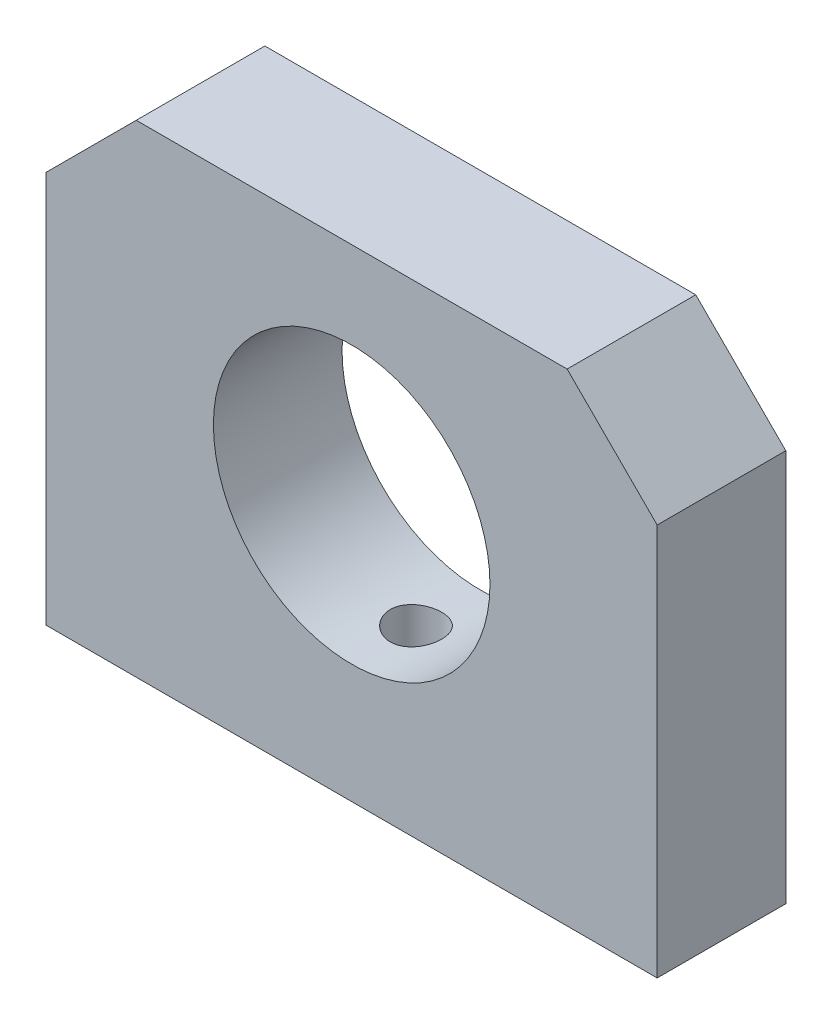
ISO-10303-21;
HEADER;
FILE_DESCRIPTION(('STEP AP214'),'2;1');
FILE_NAME('part.step','',(''),(''),'','','');
FILE_SCHEMA(('AUTOMOTIVE_DESIGN { 1 0 10303 214 1 1 1 1 }'));
ENDSEC;
DATA;
#1=APPLICATION_CONTEXT('core data for automotive mechanical design processes');
#2=APPLICATION_PROTOCOL_DEFINITION('international standard','automotive_design',2000,#1);
#3=PRODUCT_CONTEXT('',#1,'mechanical');
#4=PRODUCT('Part','Part','',(#3));
#5=PRODUCT_RELATED_PRODUCT_CATEGORY('part','',(#4));
#6=PRODUCT_DEFINITION_FORMATION('','',#4);
#7=PRODUCT_DEFINITION_CONTEXT('part definition',#1,'design');
#8=PRODUCT_DEFINITION('design','',#6,#7);
#9=PRODUCT_DEFINITION_SHAPE('','',#8);
#10=(LENGTH_UNIT() NAMED_UNIT(*) SI_UNIT(.MILLI.,.METRE.));
#11=(NAMED_UNIT(*) PLANE_ANGLE_UNIT() SI_UNIT($,.RADIAN.));
#12=(NAMED_UNIT(*) SI_UNIT($,.STERADIAN.) SOLID_ANGLE_UNIT());
#13=UNCERTAINTY_MEASURE_WITH_UNIT(LENGTH_MEASURE(1.E-05),#10,'distance_accuracy_value','');
#14=(GEOMETRIC_REPRESENTATION_CONTEXT(3) GLOBAL_UNCERTAINTY_ASSIGNED_CONTEXT((#13)) GLOBAL_UNIT_ASSIGNED_CONTEXT((#10,
#11,#12)) REPRESENTATION_CONTEXT('',''));
#15=CARTESIAN_POINT('',(0.,0.,0.));
#16=DIRECTION('',(0.,0.,1.));
#17=DIRECTION('',(1.,0.,0.));
#18=AXIS2_PLACEMENT_3D('',#15,#16,#17);
#19=CARTESIAN_POINT('',(0.,0.,20.));
#20=DIRECTION('',(0.,0.,-1.));
#21=DIRECTION('',(-1.,0.,0.));
#22=AXIS2_PLACEMENT_3D('',#19,#20,#21);
#23=PLANE('',#22);
#24=DIRECTION('',(0.,-1.,0.));
#25=VECTOR('',#24,1.);
#26=CARTESIAN_POINT('',(0.,0.,20.));
#27=LINE('',#26,#25);
#28=CARTESIAN_POINT('',(0.,61.,20.));
#29=VERTEX_POINT('',#28);
#30=CARTESIAN_POINT('',(0.,0.,20.));
#31=VERTEX_POINT('',#30);
#32=EDGE_CURVE('E134',#29,#31,#27,.T.);
#33=ORIENTED_EDGE('',*,*,#32,.T.);
#34=DIRECTION('',(1.,0.,0.));
#35=VECTOR('',#34,1.);
#36=CARTESIAN_POINT('',(0.,0.,20.));
#37=LINE('',#36,#35);
#38=CARTESIAN_POINT('',(95.,0.,20.));
#39=VERTEX_POINT('',#38);
#40=EDGE_CURVE('E92',#31,#39,#37,.T.);
#41=ORIENTED_EDGE('',*,*,#40,.T.);
#42=DIRECTION('',(0.,1.,0.));
#43=VECTOR('',#42,1.);
#44=CARTESIAN_POINT('',(95.,0.,20.));
#45=LINE('',#44,#43);
#46=CARTESIAN_POINT('',(95.,61.,20.));
#47=VERTEX_POINT('',#46);
#48=EDGE_CURVE('E105',#39,#47,#45,.T.);
#49=ORIENTED_EDGE('',*,*,#48,.T.);
#50=DIRECTION('',(-0.707106781186547,0.707106781186547,0.));
#51=VECTOR('',#50,1.);
#52=CARTESIAN_POINT('',(81.,75.,20.));
#53=LINE('',#52,#51);
#54=CARTESIAN_POINT('',(81.,75.,20.));
#55=VERTEX_POINT('',#54);
#56=EDGE_CURVE('E99',#47,#55,#53,.T.);
#57=ORIENTED_EDGE('',*,*,#56,.T.);
#58=DIRECTION('',(-1.,0.,0.));
#59=VECTOR('',#58,1.);
#60=CARTESIAN_POINT('',(14.,75.,20.));
#61=LINE('',#60,#59);
#62=CARTESIAN_POINT('',(14.,75.,20.));
#63=VERTEX_POINT('',#62);
#64=EDGE_CURVE('E103',#55,#63,#61,.T.);
#65=ORIENTED_EDGE('',*,*,#64,.T.);
#66=DIRECTION('',(-0.707106781186548,-0.707106781186547,0.));
#67=VECTOR('',#66,1.);
#68=CARTESIAN_POINT('',(0.,61.,20.));
#69=LINE('',#68,#67);
#70=EDGE_CURVE('E55',#63,#29,#69,.T.);
#71=ORIENTED_EDGE('',*,*,#70,.T.);
#72=EDGE_LOOP('',(#33,#41,#49,#57,#65,#71));
#73=FACE_BOUND('',#72,.T.);
#74=CARTESIAN_POINT('',(47.5,40.,20.));
#75=DIRECTION('',(0.,0.,1.));
#76=DIRECTION('',(1.,0.,0.));
#77=AXIS2_PLACEMENT_3D('',#74,#75,#76);
#78=CIRCLE('',#77,21.5);
#79=CARTESIAN_POINT('',(69.,40.,20.));
#80=VERTEX_POINT('',#79);
#81=EDGE_CURVE('E127',#80,#80,#78,.T.);
#82=ORIENTED_EDGE('',*,*,#81,.F.);
#83=EDGE_LOOP('',(#82));
#84=FACE_BOUND('',#83,.T.);
#85=ADVANCED_FACE('F33',(#73,#84),#23,.F.);
#86=CARTESIAN_POINT('',(0.,0.,0.));
#87=DIRECTION('',(0.,0.,-1.));
#88=DIRECTION('',(-1.,0.,0.));
#89=AXIS2_PLACEMENT_3D('',#86,#87,#88);
#90=PLANE('',#89);
#91=DIRECTION('',(0.,-1.,0.));
#92=VECTOR('',#91,1.);
#93=CARTESIAN_POINT('',(0.,0.,0.));
#94=LINE('',#93,#92);
#95=CARTESIAN_POINT('',(0.,61.,0.));
#96=VERTEX_POINT('',#95);
#97=CARTESIAN_POINT('',(0.,0.,0.));
#98=VERTEX_POINT('',#97);
#99=EDGE_CURVE('E123',#96,#98,#94,.T.);
#100=ORIENTED_EDGE('',*,*,#99,.F.);
#101=DIRECTION('',(-0.707106781186548,-0.707106781186547,0.));
#102=VECTOR('',#101,1.);
#103=CARTESIAN_POINT('',(0.,61.,0.));
#104=LINE('',#103,#102);
#105=CARTESIAN_POINT('',(14.,75.,0.));
#106=VERTEX_POINT('',#105);
#107=EDGE_CURVE('E84',#106,#96,#104,.T.);
#108=ORIENTED_EDGE('',*,*,#107,.F.);
#109=DIRECTION('',(-1.,0.,0.));
#110=VECTOR('',#109,1.);
#111=CARTESIAN_POINT('',(14.,75.,0.));
#112=LINE('',#111,#110);
#113=CARTESIAN_POINT('',(81.,75.,0.));
#114=VERTEX_POINT('',#113);
#115=EDGE_CURVE('E78',#114,#106,#112,.T.);
#116=ORIENTED_EDGE('',*,*,#115,.F.);
#117=DIRECTION('',(-0.707106781186547,0.707106781186547,0.));
#118=VECTOR('',#117,1.);
#119=CARTESIAN_POINT('',(81.,75.,0.));
#120=LINE('',#119,#118);
#121=CARTESIAN_POINT('',(95.,61.,0.));
#122=VERTEX_POINT('',#121);
#123=EDGE_CURVE('E113',#122,#114,#120,.T.);
#124=ORIENTED_EDGE('',*,*,#123,.F.);
#125=DIRECTION('',(0.,1.,0.));
#126=VECTOR('',#125,1.);
#127=CARTESIAN_POINT('',(95.,0.,0.));
#128=LINE('',#127,#126);
#129=CARTESIAN_POINT('',(95.,0.,0.));
#130=VERTEX_POINT('',#129);
#131=EDGE_CURVE('E129',#130,#122,#128,.T.);
#132=ORIENTED_EDGE('',*,*,#131,.F.);
#133=DIRECTION('',(1.,0.,0.));
#134=VECTOR('',#133,1.);
#135=CARTESIAN_POINT('',(0.,0.,0.));
#136=LINE('',#135,#134);
#137=EDGE_CURVE('E126',#98,#130,#136,.T.);
#138=ORIENTED_EDGE('',*,*,#137,.F.);
#139=EDGE_LOOP('',(#100,#108,#116,#124,#132,#138));
#140=FACE_BOUND('',#139,.T.);
#141=CARTESIAN_POINT('',(47.5,40.,0.));
#142=DIRECTION('',(0.,0.,1.));
#143=DIRECTION('',(1.,0.,0.));
#144=AXIS2_PLACEMENT_3D('',#141,#142,#143);
#145=CIRCLE('',#144,21.5);
#146=CARTESIAN_POINT('',(69.,40.,0.));
#147=VERTEX_POINT('',#146);
#148=EDGE_CURVE('E207',#147,#147,#145,.T.);
#149=ORIENTED_EDGE('',*,*,#148,.T.);
#150=EDGE_LOOP('',(#149));
#151=FACE_BOUND('',#150,.T.);
#152=ADVANCED_FACE('F144',(#140,#151),#90,.T.);
#153=CARTESIAN_POINT('',(0.,0.,20.));
#154=DIRECTION('',(1.,0.,0.));
#155=DIRECTION('',(0.,0.,-1.));
#156=AXIS2_PLACEMENT_3D('',#153,#154,#155);
#157=PLANE('',#156);
#158=ORIENTED_EDGE('',*,*,#99,.T.);
#159=DIRECTION('',(0.,0.,-1.));
#160=VECTOR('',#159,1.);
#161=CARTESIAN_POINT('',(0.,0.,20.));
#162=LINE('',#161,#160);
#163=EDGE_CURVE('E11',#31,#98,#162,.T.);
#164=ORIENTED_EDGE('',*,*,#163,.F.);
#165=ORIENTED_EDGE('',*,*,#32,.F.);
#166=DIRECTION('',(0.,0.,-1.));
#167=VECTOR('',#166,1.);
#168=CARTESIAN_POINT('',(0.,61.,20.));
#169=LINE('',#168,#167);
#170=EDGE_CURVE('E119',#29,#96,#169,.T.);
#171=ORIENTED_EDGE('',*,*,#170,.T.);
#172=EDGE_LOOP('',(#158,#164,#165,#171));
#173=FACE_BOUND('',#172,.T.);
#174=ADVANCED_FACE('F35',(#173),#157,.F.);
#175=CARTESIAN_POINT('',(0.,0.,20.));
#176=DIRECTION('',(0.,1.,0.));
#177=DIRECTION('',(0.,0.,1.));
#178=AXIS2_PLACEMENT_3D('',#175,#176,#177);
#179=PLANE('',#178);
#180=CARTESIAN_POINT('',(77.5,0.,10.));
#181=DIRECTION('',(0.,-1.,0.));
#182=DIRECTION('',(0.,0.,1.));
#183=AXIS2_PLACEMENT_3D('',#180,#181,#182);
#184=CIRCLE('',#183,4.00000000000001);
#185=CARTESIAN_POINT('',(77.5,0.,14.));
#186=VERTEX_POINT('',#185);
#187=EDGE_CURVE('E192',#186,#186,#184,.T.);
#188=ORIENTED_EDGE('',*,*,#187,.F.);
#189=EDGE_LOOP('',(#188));
#190=FACE_BOUND('',#189,.T.);
#191=CARTESIAN_POINT('',(17.5,0.,10.));
#192=DIRECTION('',(0.,-1.,0.));
#193=DIRECTION('',(0.,0.,-1.));
#194=AXIS2_PLACEMENT_3D('',#191,#192,#193);
#195=CIRCLE('',#194,4.);
#196=CARTESIAN_POINT('',(17.5,0.,6.));
#197=VERTEX_POINT('',#196);
#198=EDGE_CURVE('E191',#197,#197,#195,.T.);
#199=ORIENTED_EDGE('',*,*,#198,.F.);
#200=EDGE_LOOP('',(#199));
#201=FACE_BOUND('',#200,.T.);
#202=CARTESIAN_POINT('',(47.5,0.,10.));
#203=DIRECTION('',(0.,-1.,0.));
#204=DIRECTION('',(0.,0.,-1.));
#205=AXIS2_PLACEMENT_3D('',#202,#203,#204);
#206=CIRCLE('',#205,4.00000000000001);
#207=CARTESIAN_POINT('',(47.5,0.,5.99999999999999));
#208=VERTEX_POINT('',#207);
#209=EDGE_CURVE('E201',#208,#208,#206,.T.);
#210=ORIENTED_EDGE('',*,*,#209,.F.);
#211=EDGE_LOOP('',(#210));
#212=FACE_BOUND('',#211,.T.);
#213=ORIENTED_EDGE('',*,*,#137,.T.);
#214=DIRECTION('',(0.,0.,-1.));
#215=VECTOR('',#214,1.);
#216=CARTESIAN_POINT('',(95.,0.,20.));
#217=LINE('',#216,#215);
#218=EDGE_CURVE('E47',#39,#130,#217,.T.);
#219=ORIENTED_EDGE('',*,*,#218,.F.);
#220=ORIENTED_EDGE('',*,*,#40,.F.);
#221=ORIENTED_EDGE('',*,*,#163,.T.);
#222=EDGE_LOOP('',(#213,#219,#220,#221));
#223=FACE_BOUND('',#222,.T.);
#224=ADVANCED_FACE('F220',(#190,#201,#212,#223),#179,.F.);
#225=CARTESIAN_POINT('',(95.,0.,20.));
#226=DIRECTION('',(-1.,0.,0.));
#227=DIRECTION('',(0.,0.,1.));
#228=AXIS2_PLACEMENT_3D('',#225,#226,#227);
#229=PLANE('',#228);
#230=ORIENTED_EDGE('',*,*,#131,.T.);
#231=DIRECTION('',(0.,0.,-1.));
#232=VECTOR('',#231,1.);
#233=CARTESIAN_POINT('',(95.,61.,20.));
#234=LINE('',#233,#232);
#235=EDGE_CURVE('E114',#47,#122,#234,.T.);
#236=ORIENTED_EDGE('',*,*,#235,.F.);
#237=ORIENTED_EDGE('',*,*,#48,.F.);
#238=ORIENTED_EDGE('',*,*,#218,.T.);
#239=EDGE_LOOP('',(#230,#236,#237,#238));
#240=FACE_BOUND('',#239,.T.);
#241=ADVANCED_FACE('F141',(#240),#229,.F.);
#242=CARTESIAN_POINT('',(81.,75.,20.));
#243=DIRECTION('',(-0.707106781186548,-0.707106781186548,0.));
#244=DIRECTION('',(0.707106781186548,-0.707106781186548,0.));
#245=AXIS2_PLACEMENT_3D('',#242,#243,#244);
#246=PLANE('',#245);
#247=ORIENTED_EDGE('',*,*,#123,.T.);
#248=DIRECTION('',(0.,0.,-1.));
#249=VECTOR('',#248,1.);
#250=CARTESIAN_POINT('',(81.,75.,20.));
#251=LINE('',#250,#249);
#252=EDGE_CURVE('E110',#55,#114,#251,.T.);
#253=ORIENTED_EDGE('',*,*,#252,.F.);
#254=ORIENTED_EDGE('',*,*,#56,.F.);
#255=ORIENTED_EDGE('',*,*,#235,.T.);
#256=EDGE_LOOP('',(#247,#253,#254,#255));
#257=FACE_BOUND('',#256,.T.);
#258=ADVANCED_FACE('F111',(#257),#246,.F.);
#259=CARTESIAN_POINT('',(14.,75.,20.));
#260=DIRECTION('',(0.,-1.,0.));
#261=DIRECTION('',(0.,0.,-1.));
#262=AXIS2_PLACEMENT_3D('',#259,#260,#261);
#263=PLANE('',#262);
#264=ORIENTED_EDGE('',*,*,#115,.T.);
#265=DIRECTION('',(0.,0.,-1.));
#266=VECTOR('',#265,1.);
#267=CARTESIAN_POINT('',(14.,75.,20.));
#268=LINE('',#267,#266);
#269=EDGE_CURVE('E115',#63,#106,#268,.T.);
#270=ORIENTED_EDGE('',*,*,#269,.F.);
#271=ORIENTED_EDGE('',*,*,#64,.F.);
#272=ORIENTED_EDGE('',*,*,#252,.T.);
#273=EDGE_LOOP('',(#264,#270,#271,#272));
#274=FACE_BOUND('',#273,.T.);
#275=ADVANCED_FACE('F117',(#274),#263,.F.);
#276=CARTESIAN_POINT('',(0.,61.,20.));
#277=DIRECTION('',(0.707106781186547,-0.707106781186548,0.));
#278=DIRECTION('',(0.707106781186548,0.707106781186547,0.));
#279=AXIS2_PLACEMENT_3D('',#276,#277,#278);
#280=PLANE('',#279);
#281=ORIENTED_EDGE('',*,*,#107,.T.);
#282=ORIENTED_EDGE('',*,*,#170,.F.);
#283=ORIENTED_EDGE('',*,*,#70,.F.);
#284=ORIENTED_EDGE('',*,*,#269,.T.);
#285=EDGE_LOOP('',(#281,#282,#283,#284));
#286=FACE_BOUND('',#285,.T.);
#287=ADVANCED_FACE('F149',(#286),#280,.F.);
#288=CARTESIAN_POINT('',(47.5,40.,20.));
#289=DIRECTION('',(0.,0.,-1.));
#290=DIRECTION('',(-1.,0.,0.));
#291=AXIS2_PLACEMENT_3D('',#288,#289,#290);
#292=CYLINDRICAL_SURFACE('',#291,21.5);
#293=CARTESIAN_POINT('',(47.5,18.5,5.99999999999999));
#294=CARTESIAN_POINT('',(47.2773768124132,18.5000040203083,6.00000854024153));
#295=CARTESIAN_POINT('',(47.0546421440228,18.5034934741572,6.01864820859131));
#296=CARTESIAN_POINT('',(46.6154471780435,18.5170772858953,6.09266763617714));
#297=CARTESIAN_POINT('',(46.3989923738539,18.5271772546958,6.14807860692963));
#298=CARTESIAN_POINT('',(45.9787725542446,18.5528520645806,6.29388703971247));
#299=CARTESIAN_POINT('',(45.7749963469947,18.5684219940565,6.38425312204477));
#300=CARTESIAN_POINT('',(45.3855171440808,18.6033356495237,6.59731804053892));
#301=CARTESIAN_POINT('',(45.1998126433535,18.6226790608448,6.72001418100051));
#302=CARTESIAN_POINT('',(44.8495379079372,18.663259150875,6.99579331241119));
#303=CARTESIAN_POINT('',(44.6852117461967,18.6845136764852,7.14918371310719));
#304=CARTESIAN_POINT('',(44.3844695473845,18.7263877174251,7.48133586128891));
#305=CARTESIAN_POINT('',(44.2480554965218,18.7470071874761,7.66009941278077));
#306=CARTESIAN_POINT('',(44.0059973472466,18.7854499271584,8.03964479434478));
#307=CARTESIAN_POINT('',(43.9006010254711,18.8032501820165,8.24058718207451));
#308=CARTESIAN_POINT('',(43.7251561912919,18.8337878884841,8.6577127396151));
#309=CARTESIAN_POINT('',(43.6551046797786,18.8465257696312,8.87389461453651));
#310=CARTESIAN_POINT('',(43.55312024891,18.8653170114986,9.31275271121019));
#311=CARTESIAN_POINT('',(43.5207619826729,18.8714449026233,9.53532683405592));
#312=CARTESIAN_POINT('',(43.4937624284993,18.8765471003885,9.98282295916028));
#313=CARTESIAN_POINT('',(43.4991178110927,18.8755220385125,10.2077447524092));
#314=CARTESIAN_POINT('',(43.5470485193419,18.8665020195974,10.6504732599216));
#315=CARTESIAN_POINT('',(43.5891406073948,18.8585975585108,10.8683344062711));
#316=CARTESIAN_POINT('',(43.7085890553359,18.8368514837499,11.2938477442803));
#317=CARTESIAN_POINT('',(43.7859468927228,18.8230096213229,11.5014995078024));
#318=CARTESIAN_POINT('',(43.9742047896192,18.7908535400846,11.9021159357249));
#319=CARTESIAN_POINT('',(44.0853003792827,18.7725133734362,12.0949865477575));
#320=CARTESIAN_POINT('',(44.3377418606673,18.7334443777834,12.4595306192514));
#321=CARTESIAN_POINT('',(44.4790907765817,18.7127153100744,12.6312019568761));
#322=CARTESIAN_POINT('',(44.7906339572144,18.6708095956769,12.9512667630061));
#323=CARTESIAN_POINT('',(44.9612416460371,18.6496309939098,13.0992578527947));
#324=CARTESIAN_POINT('',(45.3250749643043,18.6095081242959,13.3645791579962));
#325=CARTESIAN_POINT('',(45.5183008139,18.5905638782005,13.4819090749364));
#326=CARTESIAN_POINT('',(45.9223021725238,18.5570068693413,13.6826350806408));
#327=CARTESIAN_POINT('',(46.1330987112143,18.5423993952636,13.7659897824836));
#328=CARTESIAN_POINT('',(46.5660337621828,18.5192027696571,13.8959948577797));
#329=CARTESIAN_POINT('',(46.7881710859193,18.5106129888432,13.9426490691581));
#330=CARTESIAN_POINT('',(47.2340197728114,18.5005058902061,13.9973698230422));
#331=CARTESIAN_POINT('',(47.457661244656,18.4988875187726,14.0059877633407));
#332=CARTESIAN_POINT('',(47.9031897831468,18.5026266179304,13.9858697514143));
#333=CARTESIAN_POINT('',(48.1250769340832,18.507983751294,13.9571356049599));
#334=CARTESIAN_POINT('',(48.5590526710942,18.5250090256018,13.8635875244524));
#335=CARTESIAN_POINT('',(48.771203383779,18.5366284209717,13.7990521555319));
#336=CARTESIAN_POINT('',(49.1816738352699,18.5648807414316,13.6360346718297));
#337=CARTESIAN_POINT('',(49.3799926452891,18.5815140027951,13.537550280067));
#338=CARTESIAN_POINT('',(49.7595260550248,18.61820106747,13.3082068440619));
#339=CARTESIAN_POINT('',(49.9405332803551,18.6382898033771,13.1770103240454));
#340=CARTESIAN_POINT('',(50.2781604042877,18.6795683073991,12.8864240350826));
#341=CARTESIAN_POINT('',(50.4347780607932,18.7007581765011,12.7270316770083));
#342=CARTESIAN_POINT('',(50.7212717167041,18.7421853456949,12.3820836487163));
#343=CARTESIAN_POINT('',(50.8507716871949,18.7624065876152,12.1962134225148));
#344=CARTESIAN_POINT('',(51.0767114573157,18.799285513433,11.805033543495));
#345=CARTESIAN_POINT('',(51.1731524737815,18.8159433284848,11.599724606533));
#346=CARTESIAN_POINT('',(51.3297014537259,18.8436837082607,11.1764569775103));
#347=CARTESIAN_POINT('',(51.3899828466072,18.8547928419889,10.9585642521975));
#348=CARTESIAN_POINT('',(51.4730371181064,18.8702391843505,10.5155175085114));
#349=CARTESIAN_POINT('',(51.4958141557441,18.8745771438657,10.2903642981085));
#350=CARTESIAN_POINT('',(51.5030756774686,18.8759523070053,9.84295354531355));
#351=CARTESIAN_POINT('',(51.4881532097185,18.8731025807433,9.62070575887691));
#352=CARTESIAN_POINT('',(51.4217365247059,18.8606739718884,9.18194534072632));
#353=CARTESIAN_POINT('',(51.3702425179544,18.8510951280292,8.96543267600764));
#354=CARTESIAN_POINT('',(51.2323930518621,18.8263348583312,8.54460095355614));
#355=CARTESIAN_POINT('',(51.1461008517332,18.811163603145,8.34026053754964));
#356=CARTESIAN_POINT('',(50.9411690680745,18.7769205578123,7.94886286990468));
#357=CARTESIAN_POINT('',(50.8225272481343,18.7578484980161,7.76180681437493));
#358=CARTESIAN_POINT('',(50.5541982175057,18.7176012424844,7.40731511760309));
#359=CARTESIAN_POINT('',(50.4040790491225,18.6963991832372,7.24020943714574));
#360=CARTESIAN_POINT('',(50.0779582024622,18.654482800713,6.93336219090374));
#361=CARTESIAN_POINT('',(49.9019505854764,18.6337685906149,6.79362692097934));
#362=CARTESIAN_POINT('',(49.5271851517348,18.5949471315943,6.54433429885563));
#363=CARTESIAN_POINT('',(49.3282399086866,18.5768645573417,6.43505475344188));
#364=CARTESIAN_POINT('',(48.9145422491759,18.5455846239239,6.25164475912532));
#365=CARTESIAN_POINT('',(48.6998049684289,18.5323826583015,6.17748114814199));
#366=CARTESIAN_POINT('',(48.3203507691927,18.5150569970724,6.08154339777357));
#367=CARTESIAN_POINT('',(48.1578582383273,18.509442384328,6.05101663939554));
#368=CARTESIAN_POINT('',(47.8302642151079,18.5019124402563,6.01024202352223));
#369=CARTESIAN_POINT('',(47.6651627874377,18.4999970173577,5.99999366404679));
#370=CARTESIAN_POINT('',(47.5,18.5,5.99999999999999));
#371=B_SPLINE_CURVE_WITH_KNOTS('',3,(#293,#294,#295,#296,#297,#298,#299,#300,#301,#302,#303,
#304,#305,#306,#307,#308,#309,#310,#311,#312,#313,#314,#315,#316,#317,#318,#319,#320,#321,#322,
#323,#324,#325,#326,#327,#328,#329,#330,#331,#332,#333,#334,#335,#336,#337,#338,#339,#340,#341,
#342,#343,#344,#345,#346,#347,#348,#349,#350,#351,#352,#353,#354,#355,#356,#357,#358,#359,#360,
#361,#362,#363,#364,#365,#366,#367,#368,#369,#370),.UNSPECIFIED.,.T.,.F.,(4,2,2,2,2,2,2,2,2,2,2,
2,2,2,2,2,2,2,2,2,2,2,2,2,2,2,2,2,2,2,2,2,2,2,2,2,2,2,4),(0.,0.667265573611451,1.33509824854828,
2.00233278681922,2.6695117082566,3.34374100537144,4.01801826356308,4.69754405309441,
5.37701217318894,6.04873623901605,6.72040100384124,7.38336157506893,8.04634992433508,
8.71325648564075,9.3802297436494,10.0575487290779,10.7348743076553,11.4130225223781,
12.0910998108499,12.7593142798395,13.4274964454885,14.0905510419247,14.7536501184789,
15.4238956875269,16.0942028349278,16.7732657068135,17.4523035810287,18.1280580459672,
18.8037375685299,19.4688544238059,20.1339674506059,20.7978767882515,21.4618320352582,
22.1355770112765,22.8094767834983,23.4893361888743,24.168552275427,24.6636047967629,
25.1586450632038),.UNSPECIFIED.);
#372=CARTESIAN_POINT('',(47.5,18.5,5.99999999999999));
#373=VERTEX_POINT('',#372);
#374=EDGE_CURVE('E37',#373,#373,#371,.T.);
#375=ORIENTED_EDGE('',*,*,#374,.F.);
#376=EDGE_LOOP('',(#375));
#377=FACE_BOUND('',#376,.T.);
#378=ORIENTED_EDGE('',*,*,#81,.T.);
#379=EDGE_LOOP('',(#378));
#380=FACE_BOUND('',#379,.T.);
#381=ORIENTED_EDGE('',*,*,#148,.F.);
#382=EDGE_LOOP('',(#381));
#383=FACE_BOUND('',#382,.T.);
#384=ADVANCED_FACE('F151',(#377,#380,#383),#292,.F.);
#385=CARTESIAN_POINT('',(47.5,20.,10.));
#386=DIRECTION('',(0.,-1.,0.));
#387=DIRECTION('',(0.,0.,-1.));
#388=AXIS2_PLACEMENT_3D('',#385,#386,#387);
#389=CYLINDRICAL_SURFACE('',#388,4.00000000000001);
#390=ORIENTED_EDGE('',*,*,#374,.T.);
#391=EDGE_LOOP('',(#390));
#392=FACE_BOUND('',#391,.T.);
#393=ORIENTED_EDGE('',*,*,#209,.T.);
#394=EDGE_LOOP('',(#393));
#395=FACE_BOUND('',#394,.T.);
#396=ADVANCED_FACE('F157',(#392,#395),#389,.F.);
#397=CARTESIAN_POINT('',(17.5,20.,10.));
#398=DIRECTION('',(0.,-1.,0.));
#399=DIRECTION('',(0.,0.,-1.));
#400=AXIS2_PLACEMENT_3D('',#397,#398,#399);
#401=CYLINDRICAL_SURFACE('',#400,4.);
#402=CARTESIAN_POINT('',(17.5,20.,10.));
#403=DIRECTION('',(0.,-1.,0.));
#404=DIRECTION('',(0.,0.,-1.));
#405=AXIS2_PLACEMENT_3D('',#402,#403,#404);
#406=CIRCLE('',#405,4.);
#407=CARTESIAN_POINT('',(17.5,20.,6.));
#408=VERTEX_POINT('',#407);
#409=EDGE_CURVE('E195',#408,#408,#406,.T.);
#410=ORIENTED_EDGE('',*,*,#409,.F.);
#411=EDGE_LOOP('',(#410));
#412=FACE_BOUND('',#411,.T.);
#413=ORIENTED_EDGE('',*,*,#198,.T.);
#414=EDGE_LOOP('',(#413));
#415=FACE_BOUND('',#414,.T.);
#416=ADVANCED_FACE('F170',(#412,#415),#401,.F.);
#417=CARTESIAN_POINT('',(17.5,20.,10.));
#418=DIRECTION('',(0.,-1.,0.));
#419=DIRECTION('',(0.,0.,-1.));
#420=AXIS2_PLACEMENT_3D('',#417,#418,#419);
#421=PLANE('',#420);
#422=ORIENTED_EDGE('',*,*,#409,.T.);
#423=EDGE_LOOP('',(#422));
#424=FACE_BOUND('',#423,.T.);
#425=ADVANCED_FACE('F174',(#424),#421,.T.);
#426=CARTESIAN_POINT('',(77.5,20.,10.));
#427=DIRECTION('',(0.,-1.,0.));
#428=DIRECTION('',(0.,0.,-1.));
#429=AXIS2_PLACEMENT_3D('',#426,#427,#428);
#430=CYLINDRICAL_SURFACE('',#429,4.00000000000001);
#431=CARTESIAN_POINT('',(77.5,20.,10.));
#432=DIRECTION('',(0.,-1.,0.));
#433=DIRECTION('',(0.,0.,1.));
#434=AXIS2_PLACEMENT_3D('',#431,#432,#433);
#435=CIRCLE('',#434,4.00000000000001);
#436=CARTESIAN_POINT('',(77.5,20.,14.));
#437=VERTEX_POINT('',#436);
#438=EDGE_CURVE('E190',#437,#437,#435,.T.);
#439=ORIENTED_EDGE('',*,*,#438,.F.);
#440=EDGE_LOOP('',(#439));
#441=FACE_BOUND('',#440,.T.);
#442=ORIENTED_EDGE('',*,*,#187,.T.);
#443=EDGE_LOOP('',(#442));
#444=FACE_BOUND('',#443,.T.);
#445=ADVANCED_FACE('F178',(#441,#444),#430,.F.);
#446=CARTESIAN_POINT('',(77.5,20.,10.));
#447=DIRECTION('',(0.,1.,0.));
#448=DIRECTION('',(0.,0.,1.));
#449=AXIS2_PLACEMENT_3D('',#446,#447,#448);
#450=PLANE('',#449);
#451=ORIENTED_EDGE('',*,*,#438,.T.);
#452=EDGE_LOOP('',(#451));
#453=FACE_BOUND('',#452,.T.);
#454=ADVANCED_FACE('F182',(#453),#450,.F.);
#455=CLOSED_SHELL('',(#85,#152,#174,#224,#241,#258,#275,#287,#384,#396,#416,#425,#445,#454));
#456=MANIFOLD_SOLID_BREP('B2',#455);
#457=ADVANCED_BREP_SHAPE_REPRESENTATION('',(#18,#456),#14);
#458=SHAPE_DEFINITION_REPRESENTATION(#9,#457);
ENDSEC;
END-ISO-10303-21;
